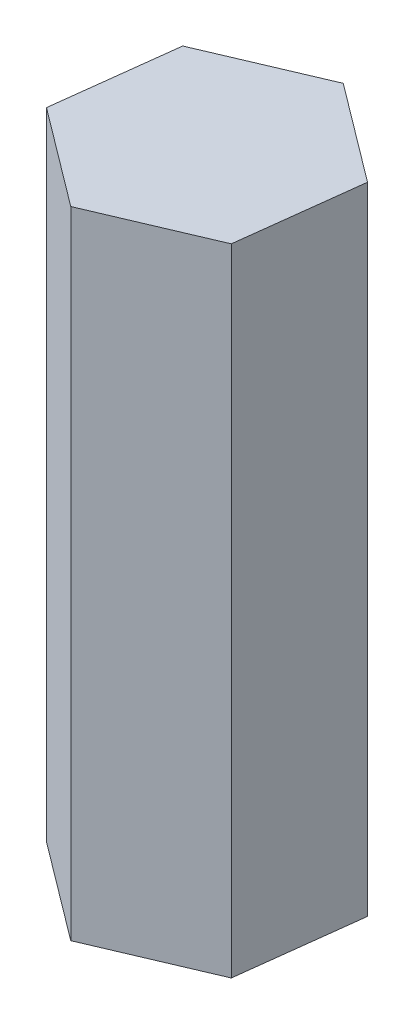
ISO-10303-21;
HEADER;
FILE_DESCRIPTION(('STEP AP214'),'2;1');
FILE_NAME('part.step','',(''),(''),'','','');
FILE_SCHEMA(('AUTOMOTIVE_DESIGN { 1 0 10303 214 1 1 1 1 }'));
ENDSEC;
DATA;
#1=APPLICATION_CONTEXT('core data for automotive mechanical design processes');
#2=APPLICATION_PROTOCOL_DEFINITION('international standard','automotive_design',2000,#1);
#3=PRODUCT_CONTEXT('',#1,'mechanical');
#4=PRODUCT('Part','Part','',(#3));
#5=PRODUCT_RELATED_PRODUCT_CATEGORY('part','',(#4));
#6=PRODUCT_DEFINITION_FORMATION('','',#4);
#7=PRODUCT_DEFINITION_CONTEXT('part definition',#1,'design');
#8=PRODUCT_DEFINITION('design','',#6,#7);
#9=PRODUCT_DEFINITION_SHAPE('','',#8);
#10=(LENGTH_UNIT() NAMED_UNIT(*) SI_UNIT(.MILLI.,.METRE.));
#11=(NAMED_UNIT(*) PLANE_ANGLE_UNIT() SI_UNIT($,.RADIAN.));
#12=(NAMED_UNIT(*) SI_UNIT($,.STERADIAN.) SOLID_ANGLE_UNIT());
#13=UNCERTAINTY_MEASURE_WITH_UNIT(LENGTH_MEASURE(1.E-05),#10,'distance_accuracy_value','');
#14=(GEOMETRIC_REPRESENTATION_CONTEXT(3) GLOBAL_UNCERTAINTY_ASSIGNED_CONTEXT((#13)) GLOBAL_UNIT_ASSIGNED_CONTEXT((#10,
#11,#12)) REPRESENTATION_CONTEXT('',''));
#15=CARTESIAN_POINT('',(0.,0.,0.));
#16=DIRECTION('',(0.,0.,1.));
#17=DIRECTION('',(1.,0.,0.));
#18=AXIS2_PLACEMENT_3D('',#15,#16,#17);
#19=CARTESIAN_POINT('',(-0.348459145534174,15.,2.86564295703896));
#20=DIRECTION('',(-0.391806176134086,0.,-0.920047781554407));
#21=DIRECTION('',(-0.920047781554407,0.,0.391806176134086));
#22=AXIS2_PLACEMENT_3D('',#19,#20,#21);
#23=PLANE('',#22);
#24=DIRECTION('',(0.920047781554407,0.,-0.391806176134086));
#25=VECTOR('',#24,1.);
#26=CARTESIAN_POINT('',(-0.348459145534174,0.,2.86564295703896));
#27=LINE('',#26,#25);
#28=CARTESIAN_POINT('',(-0.348459145534174,0.,2.86564295703896));
#29=VERTEX_POINT('',#28);
#30=CARTESIAN_POINT('',(2.30749002620461,0.,1.73459595073309));
#31=VERTEX_POINT('',#30);
#32=EDGE_CURVE('E128',#29,#31,#27,.T.);
#33=ORIENTED_EDGE('',*,*,#32,.T.);
#34=DIRECTION('',(0.,-1.,0.));
#35=VECTOR('',#34,1.);
#36=CARTESIAN_POINT('',(2.30749002620461,15.,1.73459595073309));
#37=LINE('',#36,#35);
#38=CARTESIAN_POINT('',(2.30749002620461,15.,1.73459595073309));
#39=VERTEX_POINT('',#38);
#40=EDGE_CURVE('E11',#39,#31,#37,.T.);
#41=ORIENTED_EDGE('',*,*,#40,.F.);
#42=DIRECTION('',(0.920047781554407,0.,-0.391806176134086));
#43=VECTOR('',#42,1.);
#44=CARTESIAN_POINT('',(-0.348459145534174,15.,2.86564295703896));
#45=LINE('',#44,#43);
#46=CARTESIAN_POINT('',(-0.348459145534174,15.,2.86564295703896));
#47=VERTEX_POINT('',#46);
#48=EDGE_CURVE('E144',#47,#39,#45,.T.);
#49=ORIENTED_EDGE('',*,*,#48,.F.);
#50=DIRECTION('',(0.,-1.,0.));
#51=VECTOR('',#50,1.);
#52=CARTESIAN_POINT('',(-0.348459145534174,15.,2.86564295703896));
#53=LINE('',#52,#51);
#54=EDGE_CURVE('E124',#47,#29,#53,.T.);
#55=ORIENTED_EDGE('',*,*,#54,.T.);
#56=EDGE_LOOP('',(#33,#41,#49,#55));
#57=FACE_BOUND('',#56,.T.);
#58=ADVANCED_FACE('F39',(#57),#23,.F.);
#59=CARTESIAN_POINT('',(2.30749002620461,15.,1.73459595073309));
#60=DIRECTION('',(-0.992687839588675,0.,-0.120709788885445));
#61=DIRECTION('',(-0.120709788885445,0.,0.992687839588675));
#62=AXIS2_PLACEMENT_3D('',#59,#60,#61);
#63=PLANE('',#62);
#64=DIRECTION('',(0.120709788885445,0.,-0.992687839588675));
#65=VECTOR('',#64,1.);
#66=CARTESIAN_POINT('',(2.30749002620461,0.,1.73459595073309));
#67=LINE('',#66,#65);
#68=CARTESIAN_POINT('',(2.65594917173878,0.,-1.13104700630588));
#69=VERTEX_POINT('',#68);
#70=EDGE_CURVE('E132',#31,#69,#67,.T.);
#71=ORIENTED_EDGE('',*,*,#70,.T.);
#72=DIRECTION('',(0.,-1.,0.));
#73=VECTOR('',#72,1.);
#74=CARTESIAN_POINT('',(2.65594917173878,15.,-1.13104700630588));
#75=LINE('',#74,#73);
#76=CARTESIAN_POINT('',(2.65594917173878,15.,-1.13104700630588));
#77=VERTEX_POINT('',#76);
#78=EDGE_CURVE('E48',#77,#69,#75,.T.);
#79=ORIENTED_EDGE('',*,*,#78,.F.);
#80=DIRECTION('',(0.120709788885445,0.,-0.992687839588675));
#81=VECTOR('',#80,1.);
#82=CARTESIAN_POINT('',(2.30749002620461,15.,1.73459595073309));
#83=LINE('',#82,#81);
#84=EDGE_CURVE('E93',#39,#77,#83,.T.);
#85=ORIENTED_EDGE('',*,*,#84,.F.);
#86=ORIENTED_EDGE('',*,*,#40,.T.);
#87=EDGE_LOOP('',(#71,#79,#85,#86));
#88=FACE_BOUND('',#87,.T.);
#89=ADVANCED_FACE('F172',(#88),#63,.F.);
#90=CARTESIAN_POINT('',(2.65594917173878,15.,-1.13104700630588));
#91=DIRECTION('',(-0.60088166345459,0.,0.799337992668962));
#92=DIRECTION('',(0.799337992668962,0.,0.60088166345459));
#93=AXIS2_PLACEMENT_3D('',#90,#91,#92);
#94=PLANE('',#93);
#95=DIRECTION('',(-0.799337992668962,0.,-0.60088166345459));
#96=VECTOR('',#95,1.);
#97=CARTESIAN_POINT('',(2.65594917173878,0.,-1.13104700630588));
#98=LINE('',#97,#96);
#99=CARTESIAN_POINT('',(0.34845914553417,0.,-2.86564295703897));
#100=VERTEX_POINT('',#99);
#101=EDGE_CURVE('E135',#69,#100,#98,.T.);
#102=ORIENTED_EDGE('',*,*,#101,.T.);
#103=DIRECTION('',(0.,-1.,0.));
#104=VECTOR('',#103,1.);
#105=CARTESIAN_POINT('',(0.34845914553417,15.,-2.86564295703897));
#106=LINE('',#105,#104);
#107=CARTESIAN_POINT('',(0.34845914553417,15.,-2.86564295703897));
#108=VERTEX_POINT('',#107);
#109=EDGE_CURVE('E117',#108,#100,#106,.T.);
#110=ORIENTED_EDGE('',*,*,#109,.F.);
#111=DIRECTION('',(-0.799337992668962,0.,-0.60088166345459));
#112=VECTOR('',#111,1.);
#113=CARTESIAN_POINT('',(2.65594917173878,15.,-1.13104700630588));
#114=LINE('',#113,#112);
#115=EDGE_CURVE('E106',#77,#108,#114,.T.);
#116=ORIENTED_EDGE('',*,*,#115,.F.);
#117=ORIENTED_EDGE('',*,*,#78,.T.);
#118=EDGE_LOOP('',(#102,#110,#116,#117));
#119=FACE_BOUND('',#118,.T.);
#120=ADVANCED_FACE('F154',(#119),#94,.F.);
#121=CARTESIAN_POINT('',(0.34845914553417,15.,-2.86564295703897));
#122=DIRECTION('',(0.391806176134086,0.,0.920047781554407));
#123=DIRECTION('',(0.920047781554407,0.,-0.391806176134086));
#124=AXIS2_PLACEMENT_3D('',#121,#122,#123);
#125=PLANE('',#124);
#126=DIRECTION('',(-0.920047781554407,0.,0.391806176134086));
#127=VECTOR('',#126,1.);
#128=CARTESIAN_POINT('',(0.34845914553417,0.,-2.86564295703897));
#129=LINE('',#128,#127);
#130=CARTESIAN_POINT('',(-2.30749002620461,0.,-1.73459595073311));
#131=VERTEX_POINT('',#130);
#132=EDGE_CURVE('E115',#100,#131,#129,.T.);
#133=ORIENTED_EDGE('',*,*,#132,.T.);
#134=DIRECTION('',(0.,-1.,0.));
#135=VECTOR('',#134,1.);
#136=CARTESIAN_POINT('',(-2.30749002620461,15.,-1.73459595073311));
#137=LINE('',#136,#135);
#138=CARTESIAN_POINT('',(-2.30749002620461,15.,-1.73459595073311));
#139=VERTEX_POINT('',#138);
#140=EDGE_CURVE('E112',#139,#131,#137,.T.);
#141=ORIENTED_EDGE('',*,*,#140,.F.);
#142=DIRECTION('',(-0.920047781554407,0.,0.391806176134086));
#143=VECTOR('',#142,1.);
#144=CARTESIAN_POINT('',(0.34845914553417,15.,-2.86564295703897));
#145=LINE('',#144,#143);
#146=EDGE_CURVE('E100',#108,#139,#145,.T.);
#147=ORIENTED_EDGE('',*,*,#146,.F.);
#148=ORIENTED_EDGE('',*,*,#109,.T.);
#149=EDGE_LOOP('',(#133,#141,#147,#148));
#150=FACE_BOUND('',#149,.T.);
#151=ADVANCED_FACE('F113',(#150),#125,.F.);
#152=CARTESIAN_POINT('',(-2.30749002620461,15.,-1.73459595073311));
#153=DIRECTION('',(0.992687839588675,0.,0.120709788885444));
#154=DIRECTION('',(0.120709788885444,0.,-0.992687839588675));
#155=AXIS2_PLACEMENT_3D('',#152,#153,#154);
#156=PLANE('',#155);
#157=DIRECTION('',(-0.120709788885444,0.,0.992687839588675));
#158=VECTOR('',#157,1.);
#159=CARTESIAN_POINT('',(-2.30749002620461,0.,-1.73459595073311));
#160=LINE('',#159,#158);
#161=CARTESIAN_POINT('',(-2.65594917173878,0.,1.13104700630586));
#162=VERTEX_POINT('',#161);
#163=EDGE_CURVE('E79',#131,#162,#160,.T.);
#164=ORIENTED_EDGE('',*,*,#163,.T.);
#165=DIRECTION('',(0.,-1.,0.));
#166=VECTOR('',#165,1.);
#167=CARTESIAN_POINT('',(-2.65594917173878,15.,1.13104700630586));
#168=LINE('',#167,#166);
#169=CARTESIAN_POINT('',(-2.65594917173878,15.,1.13104700630586));
#170=VERTEX_POINT('',#169);
#171=EDGE_CURVE('E118',#170,#162,#168,.T.);
#172=ORIENTED_EDGE('',*,*,#171,.F.);
#173=DIRECTION('',(-0.120709788885444,0.,0.992687839588675));
#174=VECTOR('',#173,1.);
#175=CARTESIAN_POINT('',(-2.30749002620461,15.,-1.73459595073311));
#176=LINE('',#175,#174);
#177=EDGE_CURVE('E104',#139,#170,#176,.T.);
#178=ORIENTED_EDGE('',*,*,#177,.F.);
#179=ORIENTED_EDGE('',*,*,#140,.T.);
#180=EDGE_LOOP('',(#164,#172,#178,#179));
#181=FACE_BOUND('',#180,.T.);
#182=ADVANCED_FACE('F120',(#181),#156,.F.);
#183=CARTESIAN_POINT('',(-2.65594917173878,15.,1.13104700630586));
#184=DIRECTION('',(0.600881663454589,0.,-0.799337992668962));
#185=DIRECTION('',(-0.799337992668962,0.,-0.600881663454589));
#186=AXIS2_PLACEMENT_3D('',#183,#184,#185);
#187=PLANE('',#186);
#188=DIRECTION('',(0.799337992668962,0.,0.600881663454589));
#189=VECTOR('',#188,1.);
#190=CARTESIAN_POINT('',(-2.65594917173878,0.,1.13104700630586));
#191=LINE('',#190,#189);
#192=EDGE_CURVE('E85',#162,#29,#191,.T.);
#193=ORIENTED_EDGE('',*,*,#192,.T.);
#194=ORIENTED_EDGE('',*,*,#54,.F.);
#195=DIRECTION('',(0.799337992668962,0.,0.600881663454589));
#196=VECTOR('',#195,1.);
#197=CARTESIAN_POINT('',(-2.65594917173878,15.,1.13104700630586));
#198=LINE('',#197,#196);
#199=EDGE_CURVE('E56',#170,#47,#198,.T.);
#200=ORIENTED_EDGE('',*,*,#199,.F.);
#201=ORIENTED_EDGE('',*,*,#171,.T.);
#202=EDGE_LOOP('',(#193,#194,#200,#201));
#203=FACE_BOUND('',#202,.T.);
#204=ADVANCED_FACE('F161',(#203),#187,.F.);
#205=CARTESIAN_POINT('',(0.,15.,0.));
#206=DIRECTION('',(0.,1.,0.));
#207=DIRECTION('',(0.,0.,1.));
#208=AXIS2_PLACEMENT_3D('',#205,#206,#207);
#209=PLANE('',#208);
#210=ORIENTED_EDGE('',*,*,#48,.T.);
#211=ORIENTED_EDGE('',*,*,#84,.T.);
#212=ORIENTED_EDGE('',*,*,#115,.T.);
#213=ORIENTED_EDGE('',*,*,#146,.T.);
#214=ORIENTED_EDGE('',*,*,#177,.T.);
#215=ORIENTED_EDGE('',*,*,#199,.T.);
#216=EDGE_LOOP('',(#210,#211,#212,#213,#214,#215));
#217=FACE_BOUND('',#216,.T.);
#218=ADVANCED_FACE('F102',(#217),#209,.T.);
#219=CARTESIAN_POINT('',(0.,0.,0.));
#220=DIRECTION('',(0.,1.,0.));
#221=DIRECTION('',(0.,0.,1.));
#222=AXIS2_PLACEMENT_3D('',#219,#220,#221);
#223=PLANE('',#222);
#224=ORIENTED_EDGE('',*,*,#32,.F.);
#225=ORIENTED_EDGE('',*,*,#192,.F.);
#226=ORIENTED_EDGE('',*,*,#163,.F.);
#227=ORIENTED_EDGE('',*,*,#132,.F.);
#228=ORIENTED_EDGE('',*,*,#101,.F.);
#229=ORIENTED_EDGE('',*,*,#70,.F.);
#230=EDGE_LOOP('',(#224,#225,#226,#227,#228,#229));
#231=FACE_BOUND('',#230,.T.);
#232=ADVANCED_FACE('F157',(#231),#223,.F.);
#233=CLOSED_SHELL('',(#58,#89,#120,#151,#182,#204,#218,#232));
#234=MANIFOLD_SOLID_BREP('B2',#233);
#235=ADVANCED_BREP_SHAPE_REPRESENTATION('',(#18,#234),#14);
#236=SHAPE_DEFINITION_REPRESENTATION(#9,#235);
ENDSEC;
END-ISO-10303-21;
